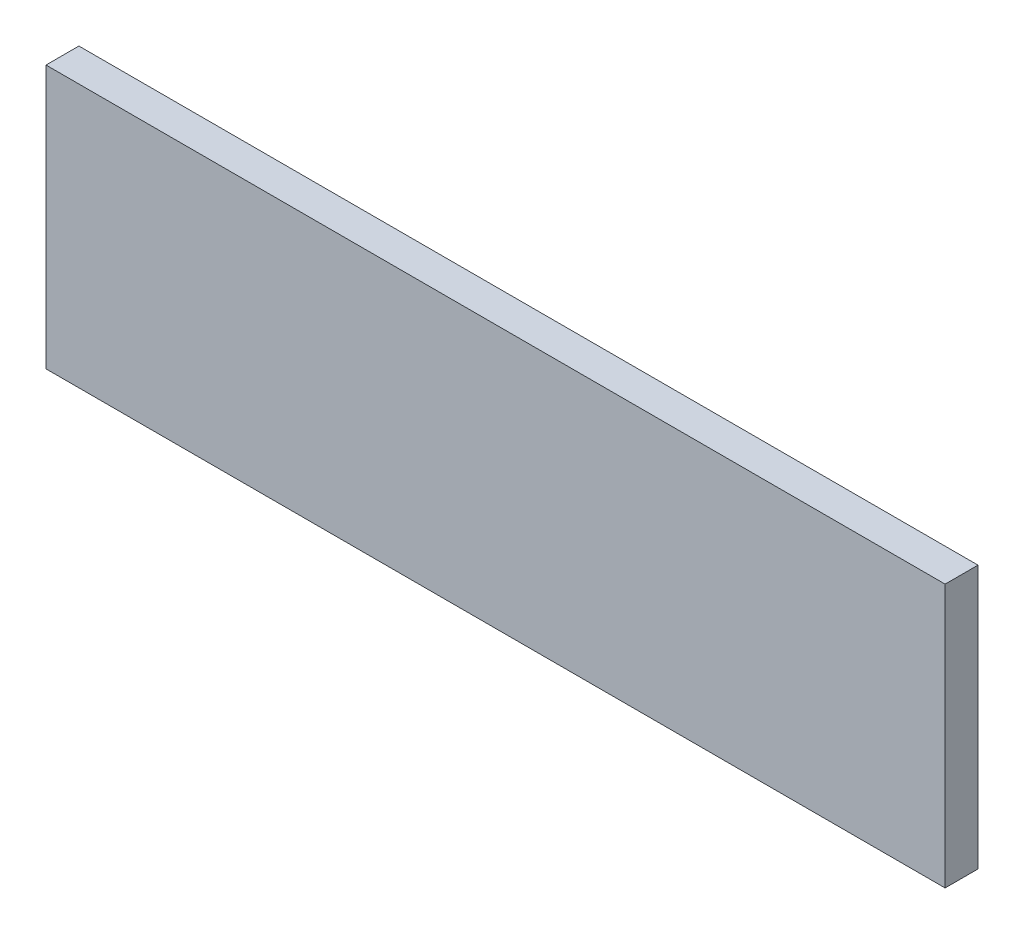
ISO-10303-21;
HEADER;
FILE_DESCRIPTION(('STEP AP214'),'2;1');
FILE_NAME('part.step','',(''),(''),'','','');
FILE_SCHEMA(('AUTOMOTIVE_DESIGN { 1 0 10303 214 1 1 1 1 }'));
ENDSEC;
DATA;
#1=APPLICATION_CONTEXT('core data for automotive mechanical design processes');
#2=APPLICATION_PROTOCOL_DEFINITION('international standard','automotive_design',2000,#1);
#3=PRODUCT_CONTEXT('',#1,'mechanical');
#4=PRODUCT('Part','Part','',(#3));
#5=PRODUCT_RELATED_PRODUCT_CATEGORY('part','',(#4));
#6=PRODUCT_DEFINITION_FORMATION('','',#4);
#7=PRODUCT_DEFINITION_CONTEXT('part definition',#1,'design');
#8=PRODUCT_DEFINITION('design','',#6,#7);
#9=PRODUCT_DEFINITION_SHAPE('','',#8);
#10=(LENGTH_UNIT() NAMED_UNIT(*) SI_UNIT(.MILLI.,.METRE.));
#11=(NAMED_UNIT(*) PLANE_ANGLE_UNIT() SI_UNIT($,.RADIAN.));
#12=(NAMED_UNIT(*) SI_UNIT($,.STERADIAN.) SOLID_ANGLE_UNIT());
#13=UNCERTAINTY_MEASURE_WITH_UNIT(LENGTH_MEASURE(1.E-05),#10,'distance_accuracy_value','');
#14=(GEOMETRIC_REPRESENTATION_CONTEXT(3) GLOBAL_UNCERTAINTY_ASSIGNED_CONTEXT((#13)) GLOBAL_UNIT_ASSIGNED_CONTEXT((#10,
#11,#12)) REPRESENTATION_CONTEXT('',''));
#15=CARTESIAN_POINT('',(0.,0.,0.));
#16=DIRECTION('',(0.,0.,1.));
#17=DIRECTION('',(1.,0.,0.));
#18=AXIS2_PLACEMENT_3D('',#15,#16,#17);
#19=CARTESIAN_POINT('',(205.,60.,15.));
#20=DIRECTION('',(-1.,0.,0.));
#21=DIRECTION('',(0.,-1.,0.));
#22=AXIS2_PLACEMENT_3D('',#19,#20,#21);
#23=PLANE('',#22);
#24=DIRECTION('',(0.,1.,0.));
#25=VECTOR('',#24,1.);
#26=CARTESIAN_POINT('',(205.,60.,0.));
#27=LINE('',#26,#25);
#28=CARTESIAN_POINT('',(205.,-60.,0.));
#29=VERTEX_POINT('',#28);
#30=CARTESIAN_POINT('',(205.,60.,0.));
#31=VERTEX_POINT('',#30);
#32=EDGE_CURVE('E104',#29,#31,#27,.T.);
#33=ORIENTED_EDGE('',*,*,#32,.T.);
#34=DIRECTION('',(0.,0.,-1.));
#35=VECTOR('',#34,1.);
#36=CARTESIAN_POINT('',(205.,60.,15.));
#37=LINE('',#36,#35);
#38=CARTESIAN_POINT('',(205.,60.,15.));
#39=VERTEX_POINT('',#38);
#40=EDGE_CURVE('E11',#39,#31,#37,.T.);
#41=ORIENTED_EDGE('',*,*,#40,.F.);
#42=DIRECTION('',(0.,1.,0.));
#43=VECTOR('',#42,1.);
#44=CARTESIAN_POINT('',(205.,60.,15.));
#45=LINE('',#44,#43);
#46=CARTESIAN_POINT('',(205.,-60.,15.));
#47=VERTEX_POINT('',#46);
#48=EDGE_CURVE('E92',#47,#39,#45,.T.);
#49=ORIENTED_EDGE('',*,*,#48,.F.);
#50=DIRECTION('',(0.,0.,-1.));
#51=VECTOR('',#50,1.);
#52=CARTESIAN_POINT('',(205.,-60.,15.));
#53=LINE('',#52,#51);
#54=EDGE_CURVE('E100',#47,#29,#53,.T.);
#55=ORIENTED_EDGE('',*,*,#54,.T.);
#56=EDGE_LOOP('',(#33,#41,#49,#55));
#57=FACE_BOUND('',#56,.T.);
#58=ADVANCED_FACE('F41',(#57),#23,.F.);
#59=CARTESIAN_POINT('',(-205.,60.,15.));
#60=DIRECTION('',(0.,-1.,0.));
#61=DIRECTION('',(0.,0.,-1.));
#62=AXIS2_PLACEMENT_3D('',#59,#60,#61);
#63=PLANE('',#62);
#64=DIRECTION('',(-1.,0.,0.));
#65=VECTOR('',#64,1.);
#66=CARTESIAN_POINT('',(-205.,60.,0.));
#67=LINE('',#66,#65);
#68=CARTESIAN_POINT('',(-205.,60.,0.));
#69=VERTEX_POINT('',#68);
#70=EDGE_CURVE('E96',#31,#69,#67,.T.);
#71=ORIENTED_EDGE('',*,*,#70,.T.);
#72=DIRECTION('',(0.,0.,-1.));
#73=VECTOR('',#72,1.);
#74=CARTESIAN_POINT('',(-205.,60.,15.));
#75=LINE('',#74,#73);
#76=CARTESIAN_POINT('',(-205.,60.,15.));
#77=VERTEX_POINT('',#76);
#78=EDGE_CURVE('E49',#77,#69,#75,.T.);
#79=ORIENTED_EDGE('',*,*,#78,.F.);
#80=DIRECTION('',(-1.,0.,0.));
#81=VECTOR('',#80,1.);
#82=CARTESIAN_POINT('',(-205.,60.,15.));
#83=LINE('',#82,#81);
#84=EDGE_CURVE('E87',#39,#77,#83,.T.);
#85=ORIENTED_EDGE('',*,*,#84,.F.);
#86=ORIENTED_EDGE('',*,*,#40,.T.);
#87=EDGE_LOOP('',(#71,#79,#85,#86));
#88=FACE_BOUND('',#87,.T.);
#89=ADVANCED_FACE('F95',(#88),#63,.F.);
#90=CARTESIAN_POINT('',(-205.,60.,15.));
#91=DIRECTION('',(1.,0.,0.));
#92=DIRECTION('',(0.,0.,-1.));
#93=AXIS2_PLACEMENT_3D('',#90,#91,#92);
#94=PLANE('',#93);
#95=DIRECTION('',(0.,-1.,0.));
#96=VECTOR('',#95,1.);
#97=CARTESIAN_POINT('',(-205.,60.,0.));
#98=LINE('',#97,#96);
#99=CARTESIAN_POINT('',(-205.,-60.,0.));
#100=VERTEX_POINT('',#99);
#101=EDGE_CURVE('E74',#69,#100,#98,.T.);
#102=ORIENTED_EDGE('',*,*,#101,.T.);
#103=DIRECTION('',(0.,0.,-1.));
#104=VECTOR('',#103,1.);
#105=CARTESIAN_POINT('',(-205.,-60.,15.));
#106=LINE('',#105,#104);
#107=CARTESIAN_POINT('',(-205.,-60.,15.));
#108=VERTEX_POINT('',#107);
#109=EDGE_CURVE('E97',#108,#100,#106,.T.);
#110=ORIENTED_EDGE('',*,*,#109,.F.);
#111=DIRECTION('',(0.,-1.,0.));
#112=VECTOR('',#111,1.);
#113=CARTESIAN_POINT('',(-205.,60.,15.));
#114=LINE('',#113,#112);
#115=EDGE_CURVE('E90',#77,#108,#114,.T.);
#116=ORIENTED_EDGE('',*,*,#115,.F.);
#117=ORIENTED_EDGE('',*,*,#78,.T.);
#118=EDGE_LOOP('',(#102,#110,#116,#117));
#119=FACE_BOUND('',#118,.T.);
#120=ADVANCED_FACE('F98',(#119),#94,.F.);
#121=CARTESIAN_POINT('',(-205.,-60.,15.));
#122=DIRECTION('',(0.,1.,0.));
#123=DIRECTION('',(0.,0.,1.));
#124=AXIS2_PLACEMENT_3D('',#121,#122,#123);
#125=PLANE('',#124);
#126=DIRECTION('',(1.,0.,0.));
#127=VECTOR('',#126,1.);
#128=CARTESIAN_POINT('',(-205.,-60.,0.));
#129=LINE('',#128,#127);
#130=EDGE_CURVE('E80',#100,#29,#129,.T.);
#131=ORIENTED_EDGE('',*,*,#130,.T.);
#132=ORIENTED_EDGE('',*,*,#54,.F.);
#133=DIRECTION('',(1.,0.,0.));
#134=VECTOR('',#133,1.);
#135=CARTESIAN_POINT('',(-205.,-60.,15.));
#136=LINE('',#135,#134);
#137=EDGE_CURVE('E57',#108,#47,#136,.T.);
#138=ORIENTED_EDGE('',*,*,#137,.F.);
#139=ORIENTED_EDGE('',*,*,#109,.T.);
#140=EDGE_LOOP('',(#131,#132,#138,#139));
#141=FACE_BOUND('',#140,.T.);
#142=ADVANCED_FACE('F111',(#141),#125,.F.);
#143=CARTESIAN_POINT('',(0.,0.,15.));
#144=DIRECTION('',(0.,0.,1.));
#145=DIRECTION('',(1.,0.,0.));
#146=AXIS2_PLACEMENT_3D('',#143,#144,#145);
#147=PLANE('',#146);
#148=ORIENTED_EDGE('',*,*,#48,.T.);
#149=ORIENTED_EDGE('',*,*,#84,.T.);
#150=ORIENTED_EDGE('',*,*,#115,.T.);
#151=ORIENTED_EDGE('',*,*,#137,.T.);
#152=EDGE_LOOP('',(#148,#149,#150,#151));
#153=FACE_BOUND('',#152,.T.);
#154=ADVANCED_FACE('F88',(#153),#147,.T.);
#155=CARTESIAN_POINT('',(0.,0.,0.));
#156=DIRECTION('',(0.,0.,1.));
#157=DIRECTION('',(1.,0.,0.));
#158=AXIS2_PLACEMENT_3D('',#155,#156,#157);
#159=PLANE('',#158);
#160=ORIENTED_EDGE('',*,*,#32,.F.);
#161=ORIENTED_EDGE('',*,*,#130,.F.);
#162=ORIENTED_EDGE('',*,*,#101,.F.);
#163=ORIENTED_EDGE('',*,*,#70,.F.);
#164=EDGE_LOOP('',(#160,#161,#162,#163));
#165=FACE_BOUND('',#164,.T.);
#166=ADVANCED_FACE('F114',(#165),#159,.F.);
#167=CLOSED_SHELL('',(#58,#89,#120,#142,#154,#166));
#168=MANIFOLD_SOLID_BREP('B2',#167);
#169=ADVANCED_BREP_SHAPE_REPRESENTATION('',(#18,#168),#14);
#170=SHAPE_DEFINITION_REPRESENTATION(#9,#169);
ENDSEC;
END-ISO-10303-21;
